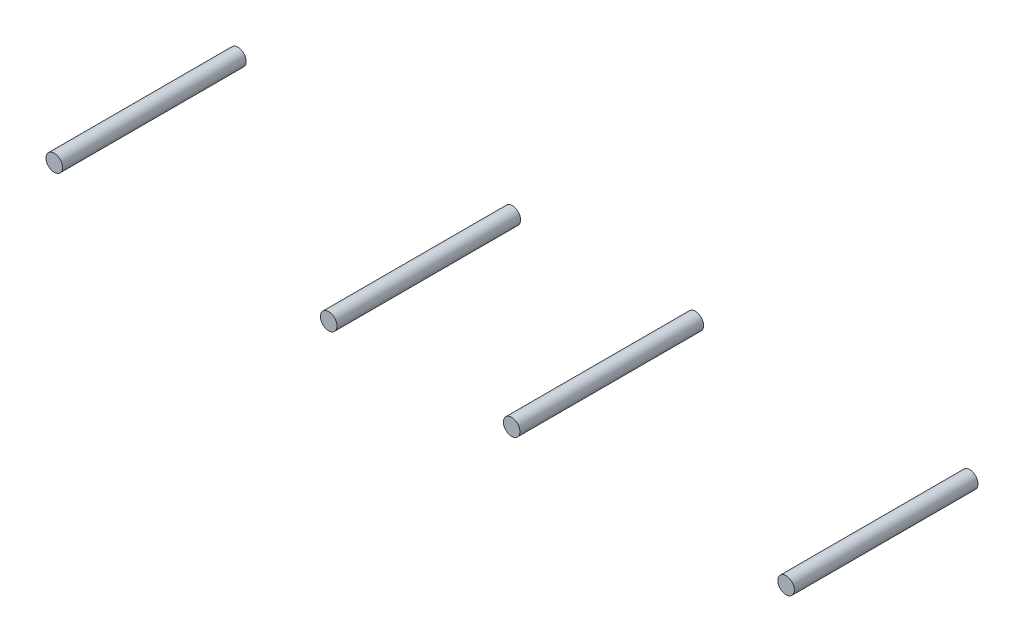
ISO-10303-21;
HEADER;
FILE_DESCRIPTION(('STEP AP214'),'2;1');
FILE_NAME('part.step','',(''),(''),'','','');
FILE_SCHEMA(('AUTOMOTIVE_DESIGN { 1 0 10303 214 1 1 1 1 }'));
ENDSEC;
DATA;
#1=APPLICATION_CONTEXT('core data for automotive mechanical design processes');
#2=APPLICATION_PROTOCOL_DEFINITION('international standard','automotive_design',2000,#1);
#3=PRODUCT_CONTEXT('',#1,'mechanical');
#4=PRODUCT('Part','Part','',(#3));
#5=PRODUCT_RELATED_PRODUCT_CATEGORY('part','',(#4));
#6=PRODUCT_DEFINITION_FORMATION('','',#4);
#7=PRODUCT_DEFINITION_CONTEXT('part definition',#1,'design');
#8=PRODUCT_DEFINITION('design','',#6,#7);
#9=PRODUCT_DEFINITION_SHAPE('','',#8);
#10=(LENGTH_UNIT() NAMED_UNIT(*) SI_UNIT(.MILLI.,.METRE.));
#11=(NAMED_UNIT(*) PLANE_ANGLE_UNIT() SI_UNIT($,.RADIAN.));
#12=(NAMED_UNIT(*) SI_UNIT($,.STERADIAN.) SOLID_ANGLE_UNIT());
#13=UNCERTAINTY_MEASURE_WITH_UNIT(LENGTH_MEASURE(1.E-05),#10,'distance_accuracy_value','');
#14=(GEOMETRIC_REPRESENTATION_CONTEXT(3) GLOBAL_UNCERTAINTY_ASSIGNED_CONTEXT((#13)) GLOBAL_UNIT_ASSIGNED_CONTEXT((#10,
#11,#12)) REPRESENTATION_CONTEXT('',''));
#15=CARTESIAN_POINT('',(0.,0.,0.));
#16=DIRECTION('',(0.,0.,1.));
#17=DIRECTION('',(1.,0.,0.));
#18=AXIS2_PLACEMENT_3D('',#15,#16,#17);
#19=CARTESIAN_POINT('',(0.,0.,-5.));
#20=DIRECTION('',(0.,0.,1.));
#21=DIRECTION('',(1.,0.,0.));
#22=AXIS2_PLACEMENT_3D('',#19,#20,#21);
#23=PLANE('',#22);
#24=CARTESIAN_POINT('',(0.,0.,-5.));
#25=DIRECTION('',(0.,0.,1.));
#26=DIRECTION('',(1.,0.,0.));
#27=AXIS2_PLACEMENT_3D('',#24,#25,#26);
#28=CIRCLE('',#27,0.23);
#29=CARTESIAN_POINT('',(0.23,0.,-5.));
#30=VERTEX_POINT('',#29);
#31=EDGE_CURVE('P0_E11',#30,#30,#28,.T.);
#32=ORIENTED_EDGE('',*,*,#31,.F.);
#33=EDGE_LOOP('',(#32));
#34=FACE_BOUND('',#33,.T.);
#35=ADVANCED_FACE('P0_F16',(#34),#23,.F.);
#36=CARTESIAN_POINT('',(0.,0.,0.1));
#37=DIRECTION('',(0.,0.,1.));
#38=DIRECTION('',(1.,0.,0.));
#39=AXIS2_PLACEMENT_3D('',#36,#37,#38);
#40=PLANE('',#39);
#41=CARTESIAN_POINT('',(0.,0.,0.1));
#42=DIRECTION('',(0.,0.,1.));
#43=DIRECTION('',(1.,0.,0.));
#44=AXIS2_PLACEMENT_3D('',#41,#42,#43);
#45=CIRCLE('',#44,0.23);
#46=CARTESIAN_POINT('',(0.23,0.,0.1));
#47=VERTEX_POINT('',#46);
#48=EDGE_CURVE('P0_E42',#47,#47,#45,.T.);
#49=ORIENTED_EDGE('',*,*,#48,.T.);
#50=EDGE_LOOP('',(#49));
#51=FACE_BOUND('',#50,.T.);
#52=ADVANCED_FACE('P0_F18',(#51),#40,.T.);
#53=CARTESIAN_POINT('',(0.,0.,-5.));
#54=DIRECTION('',(0.,0.,1.));
#55=DIRECTION('',(1.,0.,0.));
#56=AXIS2_PLACEMENT_3D('',#53,#54,#55);
#57=CYLINDRICAL_SURFACE('',#56,0.23);
#58=ORIENTED_EDGE('',*,*,#48,.F.);
#59=DIRECTION('',(0.,0.,1.));
#60=VECTOR('',#59,1.);
#61=CARTESIAN_POINT('',(0.23,0.,-5.));
#62=LINE('',#61,#60);
#63=EDGE_CURVE('P0_E20',#30,#47,#62,.T.);
#64=ORIENTED_EDGE('',*,*,#63,.F.);
#65=ORIENTED_EDGE('',*,*,#31,.T.);
#66=ORIENTED_EDGE('',*,*,#63,.T.);
#67=EDGE_LOOP('',(#58,#64,#65,#66));
#68=FACE_BOUND('',#67,.T.);
#69=ADVANCED_FACE('P0_F41',(#68),#57,.T.);
#70=CLOSED_SHELL('',(#35,#52,#69));
#71=MANIFOLD_SOLID_BREP('P0_B1',#70);
#72=CARTESIAN_POINT('',(7.62,0.,-5.));
#73=DIRECTION('',(0.,0.,1.));
#74=DIRECTION('',(1.,0.,0.));
#75=AXIS2_PLACEMENT_3D('',#72,#73,#74);
#76=PLANE('',#75);
#77=CARTESIAN_POINT('',(7.62,0.,-5.));
#78=DIRECTION('',(0.,0.,1.));
#79=DIRECTION('',(1.,0.,0.));
#80=AXIS2_PLACEMENT_3D('',#77,#78,#79);
#81=CIRCLE('',#80,0.23);
#82=CARTESIAN_POINT('',(7.85,0.,-5.));
#83=VERTEX_POINT('',#82);
#84=EDGE_CURVE('P1_E11',#83,#83,#81,.T.);
#85=ORIENTED_EDGE('',*,*,#84,.F.);
#86=EDGE_LOOP('',(#85));
#87=FACE_BOUND('',#86,.T.);
#88=ADVANCED_FACE('P1_F16',(#87),#76,.F.);
#89=CARTESIAN_POINT('',(7.62,0.,0.1));
#90=DIRECTION('',(0.,0.,1.));
#91=DIRECTION('',(1.,0.,0.));
#92=AXIS2_PLACEMENT_3D('',#89,#90,#91);
#93=PLANE('',#92);
#94=CARTESIAN_POINT('',(7.62,0.,0.1));
#95=DIRECTION('',(0.,0.,1.));
#96=DIRECTION('',(1.,0.,0.));
#97=AXIS2_PLACEMENT_3D('',#94,#95,#96);
#98=CIRCLE('',#97,0.23);
#99=CARTESIAN_POINT('',(7.85,0.,0.1));
#100=VERTEX_POINT('',#99);
#101=EDGE_CURVE('P1_E40',#100,#100,#98,.T.);
#102=ORIENTED_EDGE('',*,*,#101,.T.);
#103=EDGE_LOOP('',(#102));
#104=FACE_BOUND('',#103,.T.);
#105=ADVANCED_FACE('P1_F43',(#104),#93,.T.);
#106=CARTESIAN_POINT('',(7.62,0.,-5.));
#107=DIRECTION('',(0.,0.,1.));
#108=DIRECTION('',(1.,0.,0.));
#109=AXIS2_PLACEMENT_3D('',#106,#107,#108);
#110=CYLINDRICAL_SURFACE('',#109,0.23);
#111=ORIENTED_EDGE('',*,*,#101,.F.);
#112=DIRECTION('',(0.,0.,1.));
#113=VECTOR('',#112,1.);
#114=CARTESIAN_POINT('',(7.85,0.,-5.));
#115=LINE('',#114,#113);
#116=EDGE_CURVE('P1_E20',#83,#100,#115,.T.);
#117=ORIENTED_EDGE('',*,*,#116,.F.);
#118=ORIENTED_EDGE('',*,*,#84,.T.);
#119=ORIENTED_EDGE('',*,*,#116,.T.);
#120=EDGE_LOOP('',(#111,#117,#118,#119));
#121=FACE_BOUND('',#120,.T.);
#122=ADVANCED_FACE('P1_F18',(#121),#110,.T.);
#123=CLOSED_SHELL('',(#88,#105,#122));
#124=MANIFOLD_SOLID_BREP('P1_B1',#123);
#125=CARTESIAN_POINT('',(12.7,0.,-5.));
#126=DIRECTION('',(0.,0.,1.));
#127=DIRECTION('',(1.,0.,0.));
#128=AXIS2_PLACEMENT_3D('',#125,#126,#127);
#129=PLANE('',#128);
#130=CARTESIAN_POINT('',(12.7,0.,-5.));
#131=DIRECTION('',(0.,0.,1.));
#132=DIRECTION('',(1.,0.,0.));
#133=AXIS2_PLACEMENT_3D('',#130,#131,#132);
#134=CIRCLE('',#133,0.23);
#135=CARTESIAN_POINT('',(12.93,0.,-5.));
#136=VERTEX_POINT('',#135);
#137=EDGE_CURVE('P2_E11',#136,#136,#134,.T.);
#138=ORIENTED_EDGE('',*,*,#137,.F.);
#139=EDGE_LOOP('',(#138));
#140=FACE_BOUND('',#139,.T.);
#141=ADVANCED_FACE('P2_F16',(#140),#129,.F.);
#142=CARTESIAN_POINT('',(12.7,0.,0.1));
#143=DIRECTION('',(0.,0.,1.));
#144=DIRECTION('',(1.,0.,0.));
#145=AXIS2_PLACEMENT_3D('',#142,#143,#144);
#146=PLANE('',#145);
#147=CARTESIAN_POINT('',(12.7,0.,0.1));
#148=DIRECTION('',(0.,0.,1.));
#149=DIRECTION('',(1.,0.,0.));
#150=AXIS2_PLACEMENT_3D('',#147,#148,#149);
#151=CIRCLE('',#150,0.23);
#152=CARTESIAN_POINT('',(12.93,0.,0.1));
#153=VERTEX_POINT('',#152);
#154=EDGE_CURVE('P2_E40',#153,#153,#151,.T.);
#155=ORIENTED_EDGE('',*,*,#154,.T.);
#156=EDGE_LOOP('',(#155));
#157=FACE_BOUND('',#156,.T.);
#158=ADVANCED_FACE('P2_F43',(#157),#146,.T.);
#159=CARTESIAN_POINT('',(12.7,0.,-5.));
#160=DIRECTION('',(0.,0.,1.));
#161=DIRECTION('',(1.,0.,0.));
#162=AXIS2_PLACEMENT_3D('',#159,#160,#161);
#163=CYLINDRICAL_SURFACE('',#162,0.23);
#164=ORIENTED_EDGE('',*,*,#154,.F.);
#165=DIRECTION('',(0.,0.,1.));
#166=VECTOR('',#165,1.);
#167=CARTESIAN_POINT('',(12.93,0.,-5.));
#168=LINE('',#167,#166);
#169=EDGE_CURVE('P2_E25',#136,#153,#168,.T.);
#170=ORIENTED_EDGE('',*,*,#169,.F.);
#171=ORIENTED_EDGE('',*,*,#137,.T.);
#172=ORIENTED_EDGE('',*,*,#169,.T.);
#173=EDGE_LOOP('',(#164,#170,#171,#172));
#174=FACE_BOUND('',#173,.T.);
#175=ADVANCED_FACE('P2_F18',(#174),#163,.T.);
#176=CLOSED_SHELL('',(#141,#158,#175));
#177=MANIFOLD_SOLID_BREP('P2_B1',#176);
#178=CARTESIAN_POINT('',(20.32,0.,-5.));
#179=DIRECTION('',(0.,0.,1.));
#180=DIRECTION('',(1.,0.,0.));
#181=AXIS2_PLACEMENT_3D('',#178,#179,#180);
#182=PLANE('',#181);
#183=CARTESIAN_POINT('',(20.32,0.,-5.));
#184=DIRECTION('',(0.,0.,1.));
#185=DIRECTION('',(1.,0.,0.));
#186=AXIS2_PLACEMENT_3D('',#183,#184,#185);
#187=CIRCLE('',#186,0.23);
#188=CARTESIAN_POINT('',(20.55,0.,-5.));
#189=VERTEX_POINT('',#188);
#190=EDGE_CURVE('P3_E11',#189,#189,#187,.T.);
#191=ORIENTED_EDGE('',*,*,#190,.F.);
#192=EDGE_LOOP('',(#191));
#193=FACE_BOUND('',#192,.T.);
#194=ADVANCED_FACE('P3_F16',(#193),#182,.F.);
#195=CARTESIAN_POINT('',(20.32,0.,0.1));
#196=DIRECTION('',(0.,0.,1.));
#197=DIRECTION('',(1.,0.,0.));
#198=AXIS2_PLACEMENT_3D('',#195,#196,#197);
#199=PLANE('',#198);
#200=CARTESIAN_POINT('',(20.32,0.,0.1));
#201=DIRECTION('',(0.,0.,1.));
#202=DIRECTION('',(1.,0.,0.));
#203=AXIS2_PLACEMENT_3D('',#200,#201,#202);
#204=CIRCLE('',#203,0.23);
#205=CARTESIAN_POINT('',(20.55,0.,0.1));
#206=VERTEX_POINT('',#205);
#207=EDGE_CURVE('P3_E19',#206,#206,#204,.T.);
#208=ORIENTED_EDGE('',*,*,#207,.T.);
#209=EDGE_LOOP('',(#208));
#210=FACE_BOUND('',#209,.T.);
#211=ADVANCED_FACE('P3_F44',(#210),#199,.T.);
#212=CARTESIAN_POINT('',(20.32,0.,-5.));
#213=DIRECTION('',(0.,0.,1.));
#214=DIRECTION('',(1.,0.,0.));
#215=AXIS2_PLACEMENT_3D('',#212,#213,#214);
#216=CYLINDRICAL_SURFACE('',#215,0.23);
#217=ORIENTED_EDGE('',*,*,#207,.F.);
#218=DIRECTION('',(0.,0.,1.));
#219=VECTOR('',#218,1.);
#220=CARTESIAN_POINT('',(20.55,0.,-5.));
#221=LINE('',#220,#219);
#222=EDGE_CURVE('P3_E25',#189,#206,#221,.T.);
#223=ORIENTED_EDGE('',*,*,#222,.F.);
#224=ORIENTED_EDGE('',*,*,#190,.T.);
#225=ORIENTED_EDGE('',*,*,#222,.T.);
#226=EDGE_LOOP('',(#217,#223,#224,#225));
#227=FACE_BOUND('',#226,.T.);
#228=ADVANCED_FACE('P3_F41',(#227),#216,.T.);
#229=CLOSED_SHELL('',(#194,#211,#228));
#230=MANIFOLD_SOLID_BREP('P3_B1',#229);
#231=ADVANCED_BREP_SHAPE_REPRESENTATION('',(#18,#71,#124,#177,#230),#14);
#232=SHAPE_DEFINITION_REPRESENTATION(#9,#231);
ENDSEC;
END-ISO-10303-21;
